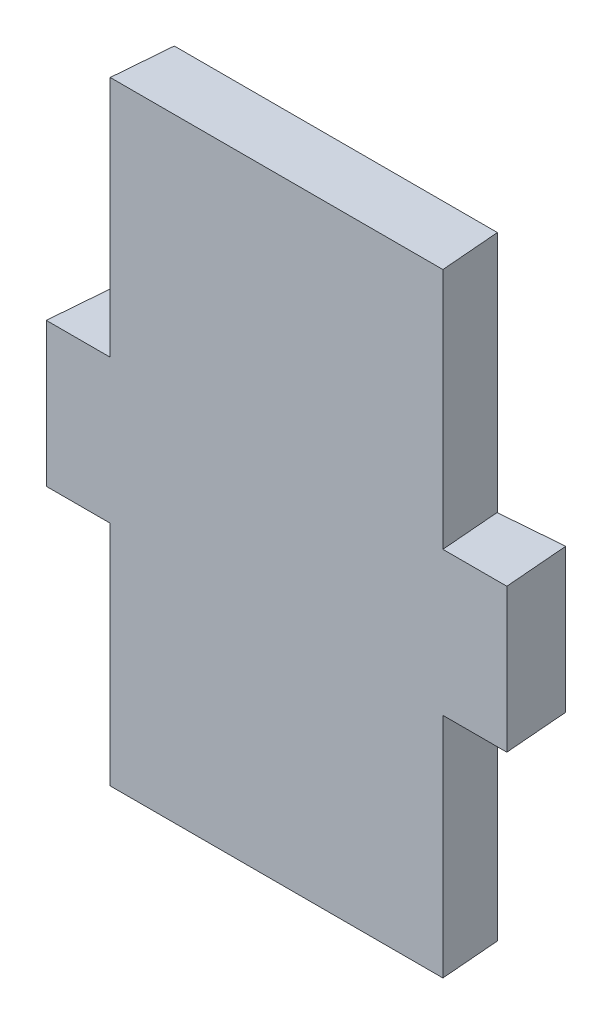
ISO-10303-21;
HEADER;
FILE_DESCRIPTION(('STEP AP214'),'2;1');
FILE_NAME('part.step','',(''),(''),'','','');
FILE_SCHEMA(('AUTOMOTIVE_DESIGN { 1 0 10303 214 1 1 1 1 }'));
ENDSEC;
DATA;
#1=APPLICATION_CONTEXT('core data for automotive mechanical design processes');
#2=APPLICATION_PROTOCOL_DEFINITION('international standard','automotive_design',2000,#1);
#3=PRODUCT_CONTEXT('',#1,'mechanical');
#4=PRODUCT('Part','Part','',(#3));
#5=PRODUCT_RELATED_PRODUCT_CATEGORY('part','',(#4));
#6=PRODUCT_DEFINITION_FORMATION('','',#4);
#7=PRODUCT_DEFINITION_CONTEXT('part definition',#1,'design');
#8=PRODUCT_DEFINITION('design','',#6,#7);
#9=PRODUCT_DEFINITION_SHAPE('','',#8);
#10=(LENGTH_UNIT() NAMED_UNIT(*) SI_UNIT(.MILLI.,.METRE.));
#11=(NAMED_UNIT(*) PLANE_ANGLE_UNIT() SI_UNIT($,.RADIAN.));
#12=(NAMED_UNIT(*) SI_UNIT($,.STERADIAN.) SOLID_ANGLE_UNIT());
#13=UNCERTAINTY_MEASURE_WITH_UNIT(LENGTH_MEASURE(1.E-05),#10,'distance_accuracy_value','');
#14=(GEOMETRIC_REPRESENTATION_CONTEXT(3) GLOBAL_UNCERTAINTY_ASSIGNED_CONTEXT((#13)) GLOBAL_UNIT_ASSIGNED_CONTEXT((#10,
#11,#12)) REPRESENTATION_CONTEXT('',''));
#15=CARTESIAN_POINT('',(0.,0.,0.));
#16=DIRECTION('',(0.,0.,1.));
#17=DIRECTION('',(1.,0.,0.));
#18=AXIS2_PLACEMENT_3D('',#15,#16,#17);
#19=CARTESIAN_POINT('',(15.4310649299438,-45.,55.6777836290186));
#20=DIRECTION('',(0.996750238596396,0.,-0.0805540927453614));
#21=DIRECTION('',(-0.0805540927453614,0.,-0.996750238596396));
#22=AXIS2_PLACEMENT_3D('',#19,#20,#21);
#23=PLANE('',#22);
#24=DIRECTION('',(0.,-1.,0.));
#25=VECTOR('',#24,1.);
#26=CARTESIAN_POINT('',(15.5379221305274,-45.,57.));
#27=LINE('',#26,#25);
#28=CARTESIAN_POINT('',(15.5379221305274,-18.65,57.));
#29=VERTEX_POINT('',#28);
#30=CARTESIAN_POINT('',(15.5379221305274,-28.35,57.));
#31=VERTEX_POINT('',#30);
#32=EDGE_CURVE('E169',#29,#31,#27,.T.);
#33=ORIENTED_EDGE('',*,*,#32,.T.);
#34=DIRECTION('',(-0.0805540927453614,0.,-0.996750238596396));
#35=VECTOR('',#34,1.);
#36=CARTESIAN_POINT('',(15.5621671488759,-28.35,57.3));
#37=LINE('',#36,#35);
#38=CARTESIAN_POINT('',(15.1886147464591,-28.35,52.6777836290185));
#39=VERTEX_POINT('',#38);
#40=EDGE_CURVE('E172',#31,#39,#37,.T.);
#41=ORIENTED_EDGE('',*,*,#40,.T.);
#42=DIRECTION('',(0.,1.,0.));
#43=VECTOR('',#42,1.);
#44=CARTESIAN_POINT('',(15.1886147464591,-45.,52.6777836290185));
#45=LINE('',#44,#43);
#46=CARTESIAN_POINT('',(15.1886147464591,-18.65,52.6777836290186));
#47=VERTEX_POINT('',#46);
#48=EDGE_CURVE('E200',#39,#47,#45,.T.);
#49=ORIENTED_EDGE('',*,*,#48,.T.);
#50=DIRECTION('',(0.0805540927453614,0.,0.996750238596396));
#51=VECTOR('',#50,1.);
#52=CARTESIAN_POINT('',(14.9599410652305,-18.65,49.8482496034069));
#53=LINE('',#52,#51);
#54=EDGE_CURVE('E202',#47,#29,#53,.T.);
#55=ORIENTED_EDGE('',*,*,#54,.T.);
#56=EDGE_LOOP('',(#33,#41,#49,#55));
#57=FACE_BOUND('',#56,.T.);
#58=ADVANCED_FACE('F34',(#57),#23,.T.);
#59=CARTESIAN_POINT('',(-15.4310649299438,-45.,55.6777836290186));
#60=DIRECTION('',(-0.996750238596396,0.,-0.0805540927453614));
#61=DIRECTION('',(0.0805540927453614,0.,-0.996750238596396));
#62=AXIS2_PLACEMENT_3D('',#59,#60,#61);
#63=PLANE('',#62);
#64=DIRECTION('',(0.0805540927453614,0.,-0.996750238596396));
#65=VECTOR('',#64,1.);
#66=CARTESIAN_POINT('',(-15.5621671488759,-28.35,57.3));
#67=LINE('',#66,#65);
#68=CARTESIAN_POINT('',(-15.5379221305274,-28.35,57.));
#69=VERTEX_POINT('',#68);
#70=CARTESIAN_POINT('',(-15.1886147464591,-28.35,52.6777836290185));
#71=VERTEX_POINT('',#70);
#72=EDGE_CURVE('E135',#69,#71,#67,.T.);
#73=ORIENTED_EDGE('',*,*,#72,.F.);
#74=DIRECTION('',(0.,1.,0.));
#75=VECTOR('',#74,1.);
#76=CARTESIAN_POINT('',(-15.5379221305274,-45.,57.));
#77=LINE('',#76,#75);
#78=CARTESIAN_POINT('',(-15.5379221305274,-18.65,57.));
#79=VERTEX_POINT('',#78);
#80=EDGE_CURVE('E145',#69,#79,#77,.T.);
#81=ORIENTED_EDGE('',*,*,#80,.T.);
#82=DIRECTION('',(-0.0805540927453614,0.,0.996750238596396));
#83=VECTOR('',#82,1.);
#84=CARTESIAN_POINT('',(-14.9599410652305,-18.65,49.8482496034069));
#85=LINE('',#84,#83);
#86=CARTESIAN_POINT('',(-15.1886147464591,-18.65,52.6777836290185));
#87=VERTEX_POINT('',#86);
#88=EDGE_CURVE('E155',#87,#79,#85,.T.);
#89=ORIENTED_EDGE('',*,*,#88,.F.);
#90=DIRECTION('',(0.,1.,0.));
#91=VECTOR('',#90,1.);
#92=CARTESIAN_POINT('',(-15.1886147464591,-45.,52.6777836290185));
#93=LINE('',#92,#91);
#94=EDGE_CURVE('E146',#71,#87,#93,.T.);
#95=ORIENTED_EDGE('',*,*,#94,.F.);
#96=EDGE_LOOP('',(#73,#81,#89,#95));
#97=FACE_BOUND('',#96,.T.);
#98=ADVANCED_FACE('F248',(#97),#63,.T.);
#99=CARTESIAN_POINT('',(-10.673915039266,-18.65,50.1946322022119));
#100=DIRECTION('',(0.,-1.,0.));
#101=DIRECTION('',(1.,0.,0.));
#102=AXIS2_PLACEMENT_3D('',#99,#100,#101);
#103=PLANE('',#102);
#104=ORIENTED_EDGE('',*,*,#88,.T.);
#105=DIRECTION('',(-1.,0.,0.));
#106=VECTOR('',#105,1.);
#107=CARTESIAN_POINT('',(15.,-18.65,57.));
#108=LINE('',#107,#106);
#109=CARTESIAN_POINT('',(-11.2239025963508,-18.65,57.));
#110=VERTEX_POINT('',#109);
#111=EDGE_CURVE('E163',#110,#79,#108,.T.);
#112=ORIENTED_EDGE('',*,*,#111,.F.);
#113=DIRECTION('',(-0.0805540927453614,0.,0.996750238596396));
#114=VECTOR('',#113,1.);
#115=CARTESIAN_POINT('',(-10.673915039266,-18.65,50.1946322022119));
#116=LINE('',#115,#114);
#117=CARTESIAN_POINT('',(-10.9025887204946,-18.65,53.0241662278236));
#118=VERTEX_POINT('',#117);
#119=EDGE_CURVE('E152',#118,#110,#116,.T.);
#120=ORIENTED_EDGE('',*,*,#119,.F.);
#121=DIRECTION('',(-0.996750238596396,0.,-0.0805540927453615));
#122=VECTOR('',#121,1.);
#123=CARTESIAN_POINT('',(-15.1886147464591,-18.65,52.6777836290186));
#124=LINE('',#123,#122);
#125=EDGE_CURVE('E138',#118,#87,#124,.T.);
#126=ORIENTED_EDGE('',*,*,#125,.T.);
#127=EDGE_LOOP('',(#104,#112,#120,#126));
#128=FACE_BOUND('',#127,.T.);
#129=ADVANCED_FACE('F253',(#128),#103,.F.);
#130=CARTESIAN_POINT('',(-15.1886147464591,-45.,52.6777836290185));
#131=DIRECTION('',(0.0805540927453615,0.,-0.996750238596396));
#132=DIRECTION('',(-0.996750238596396,0.,-0.0805540927453615));
#133=AXIS2_PLACEMENT_3D('',#130,#131,#132);
#134=PLANE('',#133);
#135=DIRECTION('',(0.996750238596396,0.,0.0805540927453615));
#136=VECTOR('',#135,1.);
#137=CARTESIAN_POINT('',(-15.1886147464591,-28.35,52.6777836290185));
#138=LINE('',#137,#136);
#139=CARTESIAN_POINT('',(-10.9025887204946,-28.35,53.0241662278236));
#140=VERTEX_POINT('',#139);
#141=EDGE_CURVE('E129',#71,#140,#138,.T.);
#142=ORIENTED_EDGE('',*,*,#141,.F.);
#143=ORIENTED_EDGE('',*,*,#94,.T.);
#144=ORIENTED_EDGE('',*,*,#125,.F.);
#145=DIRECTION('',(0.,-1.,0.));
#146=VECTOR('',#145,1.);
#147=CARTESIAN_POINT('',(-10.9025887204946,-18.65,53.0241662278236));
#148=LINE('',#147,#146);
#149=EDGE_CURVE('E141',#118,#140,#148,.T.);
#150=ORIENTED_EDGE('',*,*,#149,.T.);
#151=EDGE_LOOP('',(#142,#143,#144,#150));
#152=FACE_BOUND('',#151,.T.);
#153=ADVANCED_FACE('F142',(#152),#134,.T.);
#154=CARTESIAN_POINT('',(-11.2761411229114,-28.35,57.646382598805));
#155=DIRECTION('',(0.,1.,0.));
#156=DIRECTION('',(-1.,0.,0.));
#157=AXIS2_PLACEMENT_3D('',#154,#155,#156);
#158=PLANE('',#157);
#159=ORIENTED_EDGE('',*,*,#141,.T.);
#160=DIRECTION('',(0.0805540927453614,0.,-0.996750238596396));
#161=VECTOR('',#160,1.);
#162=CARTESIAN_POINT('',(-11.2761411229114,-28.35,57.646382598805));
#163=LINE('',#162,#161);
#164=CARTESIAN_POINT('',(-11.2239025963508,-28.35,57.));
#165=VERTEX_POINT('',#164);
#166=EDGE_CURVE('E133',#165,#140,#163,.T.);
#167=ORIENTED_EDGE('',*,*,#166,.F.);
#168=DIRECTION('',(1.,0.,0.));
#169=VECTOR('',#168,1.);
#170=CARTESIAN_POINT('',(15.,-28.35,57.));
#171=LINE('',#170,#169);
#172=EDGE_CURVE('E161',#69,#165,#171,.T.);
#173=ORIENTED_EDGE('',*,*,#172,.F.);
#174=ORIENTED_EDGE('',*,*,#72,.T.);
#175=EDGE_LOOP('',(#159,#167,#173,#174));
#176=FACE_BOUND('',#175,.T.);
#177=ADVANCED_FACE('F131',(#176),#158,.F.);
#178=CARTESIAN_POINT('',(-17.6548726000009,-43.7,49.7467038984816));
#179=DIRECTION('',(0.,1.,0.));
#180=DIRECTION('',(0.,0.,1.));
#181=AXIS2_PLACEMENT_3D('',#178,#179,#180);
#182=PLANE('',#181);
#183=DIRECTION('',(1.,0.,0.));
#184=VECTOR('',#183,1.);
#185=CARTESIAN_POINT('',(15.,-43.7,53.));
#186=LINE('',#185,#184);
#187=CARTESIAN_POINT('',(-10.9006356850379,-43.7,53.));
#188=VERTEX_POINT('',#187);
#189=CARTESIAN_POINT('',(10.9006356850379,-43.7,53.));
#190=VERTEX_POINT('',#189);
#191=EDGE_CURVE('E42',#188,#190,#186,.T.);
#192=ORIENTED_EDGE('',*,*,#191,.T.);
#193=DIRECTION('',(-0.0805540927453614,0.,-0.996750238596396));
#194=VECTOR('',#193,1.);
#195=CARTESIAN_POINT('',(6.57440938416514,-43.7,-0.531322253831391));
#196=LINE('',#195,#194);
#197=CARTESIAN_POINT('',(11.2239025963508,-43.7,57.));
#198=VERTEX_POINT('',#197);
#199=EDGE_CURVE('E70',#198,#190,#196,.T.);
#200=ORIENTED_EDGE('',*,*,#199,.F.);
#201=DIRECTION('',(1.,0.,0.));
#202=VECTOR('',#201,1.);
#203=CARTESIAN_POINT('',(15.,-43.7,57.));
#204=LINE('',#203,#202);
#205=CARTESIAN_POINT('',(-11.2239025963508,-43.7,57.));
#206=VERTEX_POINT('',#205);
#207=EDGE_CURVE('E179',#206,#198,#204,.T.);
#208=ORIENTED_EDGE('',*,*,#207,.F.);
#209=DIRECTION('',(-0.0805540927453614,0.,0.996750238596396));
#210=VECTOR('',#209,1.);
#211=CARTESIAN_POINT('',(-6.57440938416514,-43.7,-0.531322253831391));
#212=LINE('',#211,#210);
#213=EDGE_CURVE('E153',#188,#206,#212,.T.);
#214=ORIENTED_EDGE('',*,*,#213,.F.);
#215=EDGE_LOOP('',(#192,#200,#208,#214));
#216=FACE_BOUND('',#215,.T.);
#217=ADVANCED_FACE('F244',(#216),#182,.F.);
#218=CARTESIAN_POINT('',(11.2761411229114,-28.35,57.646382598805));
#219=DIRECTION('',(0.,-1.,0.));
#220=DIRECTION('',(1.,0.,0.));
#221=AXIS2_PLACEMENT_3D('',#218,#219,#220);
#222=PLANE('',#221);
#223=DIRECTION('',(-1.,0.,0.));
#224=VECTOR('',#223,1.);
#225=CARTESIAN_POINT('',(15.,-28.35,57.));
#226=LINE('',#225,#224);
#227=CARTESIAN_POINT('',(11.2239025963508,-28.35,57.));
#228=VERTEX_POINT('',#227);
#229=EDGE_CURVE('E207',#31,#228,#226,.T.);
#230=ORIENTED_EDGE('',*,*,#229,.T.);
#231=DIRECTION('',(-0.0805540927453614,0.,-0.996750238596396));
#232=VECTOR('',#231,1.);
#233=CARTESIAN_POINT('',(11.2761411229114,-28.35,57.646382598805));
#234=LINE('',#233,#232);
#235=CARTESIAN_POINT('',(10.9025887204946,-28.35,53.0241662278236));
#236=VERTEX_POINT('',#235);
#237=EDGE_CURVE('E204',#228,#236,#234,.T.);
#238=ORIENTED_EDGE('',*,*,#237,.T.);
#239=DIRECTION('',(0.996750238596396,0.,-0.0805540927453615));
#240=VECTOR('',#239,1.);
#241=CARTESIAN_POINT('',(15.1886147464591,-28.35,52.6777836290185));
#242=LINE('',#241,#240);
#243=EDGE_CURVE('E173',#236,#39,#242,.T.);
#244=ORIENTED_EDGE('',*,*,#243,.T.);
#245=ORIENTED_EDGE('',*,*,#40,.F.);
#246=EDGE_LOOP('',(#230,#238,#244,#245));
#247=FACE_BOUND('',#246,.T.);
#248=ADVANCED_FACE('F232',(#247),#222,.T.);
#249=CARTESIAN_POINT('',(15.1886147464591,-45.,52.6777836290185));
#250=DIRECTION('',(0.0805540927453615,0.,0.996750238596396));
#251=DIRECTION('',(0.996750238596396,0.,-0.0805540927453615));
#252=AXIS2_PLACEMENT_3D('',#249,#250,#251);
#253=PLANE('',#252);
#254=ORIENTED_EDGE('',*,*,#243,.F.);
#255=DIRECTION('',(0.,-1.,0.));
#256=VECTOR('',#255,1.);
#257=CARTESIAN_POINT('',(10.9025887204946,-18.65,53.0241662278236));
#258=LINE('',#257,#256);
#259=CARTESIAN_POINT('',(10.9025887204946,-18.65,53.0241662278236));
#260=VERTEX_POINT('',#259);
#261=EDGE_CURVE('E186',#260,#236,#258,.T.);
#262=ORIENTED_EDGE('',*,*,#261,.F.);
#263=DIRECTION('',(-0.996750238596396,0.,0.0805540927453615));
#264=VECTOR('',#263,1.);
#265=CARTESIAN_POINT('',(15.1886147464591,-18.65,52.6777836290186));
#266=LINE('',#265,#264);
#267=EDGE_CURVE('E162',#47,#260,#266,.T.);
#268=ORIENTED_EDGE('',*,*,#267,.F.);
#269=ORIENTED_EDGE('',*,*,#48,.F.);
#270=EDGE_LOOP('',(#254,#262,#268,#269));
#271=FACE_BOUND('',#270,.T.);
#272=ADVANCED_FACE('F236',(#271),#253,.F.);
#273=CARTESIAN_POINT('',(10.673915039266,-18.65,50.1946322022119));
#274=DIRECTION('',(0.,1.,0.));
#275=DIRECTION('',(-1.,0.,0.));
#276=AXIS2_PLACEMENT_3D('',#273,#274,#275);
#277=PLANE('',#276);
#278=ORIENTED_EDGE('',*,*,#267,.T.);
#279=DIRECTION('',(0.0805540927453614,0.,0.996750238596396));
#280=VECTOR('',#279,1.);
#281=CARTESIAN_POINT('',(10.673915039266,-18.65,50.1946322022119));
#282=LINE('',#281,#280);
#283=CARTESIAN_POINT('',(11.2239025963508,-18.65,57.));
#284=VERTEX_POINT('',#283);
#285=EDGE_CURVE('E214',#260,#284,#282,.T.);
#286=ORIENTED_EDGE('',*,*,#285,.T.);
#287=DIRECTION('',(1.,0.,0.));
#288=VECTOR('',#287,1.);
#289=CARTESIAN_POINT('',(15.,-18.65,57.));
#290=LINE('',#289,#288);
#291=EDGE_CURVE('E213',#284,#29,#290,.T.);
#292=ORIENTED_EDGE('',*,*,#291,.T.);
#293=ORIENTED_EDGE('',*,*,#54,.F.);
#294=EDGE_LOOP('',(#278,#286,#292,#293));
#295=FACE_BOUND('',#294,.T.);
#296=ADVANCED_FACE('F221',(#295),#277,.T.);
#297=CARTESIAN_POINT('',(-6.57440938416514,0.,-0.531322253831391));
#298=DIRECTION('',(0.996750238596396,0.,0.0805540927453614));
#299=DIRECTION('',(0.0805540927453614,0.,-0.996750238596396));
#300=AXIS2_PLACEMENT_3D('',#297,#298,#299);
#301=PLANE('',#300);
#302=DIRECTION('',(0.,-1.,0.));
#303=VECTOR('',#302,1.);
#304=CARTESIAN_POINT('',(-11.2239025963508,-1.00000000000001,57.));
#305=LINE('',#304,#303);
#306=CARTESIAN_POINT('',(-11.2239025963508,-2.3,57.));
#307=VERTEX_POINT('',#306);
#308=EDGE_CURVE('E123',#307,#110,#305,.T.);
#309=ORIENTED_EDGE('',*,*,#308,.F.);
#310=DIRECTION('',(0.0805540927453614,0.,-0.996750238596396));
#311=VECTOR('',#310,1.);
#312=CARTESIAN_POINT('',(-6.57440938416514,-2.3,-0.531322253831391));
#313=LINE('',#312,#311);
#314=CARTESIAN_POINT('',(-10.9006356850379,-2.3,53.));
#315=VERTEX_POINT('',#314);
#316=EDGE_CURVE('E180',#307,#315,#313,.T.);
#317=ORIENTED_EDGE('',*,*,#316,.T.);
#318=DIRECTION('',(0.,-1.,0.));
#319=VECTOR('',#318,1.);
#320=CARTESIAN_POINT('',(-10.9006356850379,-1.00000000000001,53.));
#321=LINE('',#320,#319);
#322=EDGE_CURVE('E57',#315,#188,#321,.T.);
#323=ORIENTED_EDGE('',*,*,#322,.T.);
#324=ORIENTED_EDGE('',*,*,#213,.T.);
#325=DIRECTION('',(0.,-1.,0.));
#326=VECTOR('',#325,1.);
#327=CARTESIAN_POINT('',(-11.2239025963508,-1.00000000000001,57.));
#328=LINE('',#327,#326);
#329=EDGE_CURVE('E151',#165,#206,#328,.T.);
#330=ORIENTED_EDGE('',*,*,#329,.F.);
#331=ORIENTED_EDGE('',*,*,#166,.T.);
#332=ORIENTED_EDGE('',*,*,#149,.F.);
#333=ORIENTED_EDGE('',*,*,#119,.T.);
#334=EDGE_LOOP('',(#309,#317,#323,#324,#330,#331,#332,#333));
#335=FACE_BOUND('',#334,.T.);
#336=ADVANCED_FACE('F149',(#335),#301,.F.);
#337=CARTESIAN_POINT('',(6.57440938416514,0.,-0.531322253831391));
#338=DIRECTION('',(-0.996750238596396,0.,0.0805540927453614));
#339=DIRECTION('',(-0.0805540927453614,0.,-0.996750238596396));
#340=AXIS2_PLACEMENT_3D('',#337,#338,#339);
#341=PLANE('',#340);
#342=DIRECTION('',(0.,1.,0.));
#343=VECTOR('',#342,1.);
#344=CARTESIAN_POINT('',(10.9006356850379,-1.00000000000001,53.));
#345=LINE('',#344,#343);
#346=CARTESIAN_POINT('',(10.9006356850379,-2.3,53.));
#347=VERTEX_POINT('',#346);
#348=EDGE_CURVE('E188',#190,#347,#345,.T.);
#349=ORIENTED_EDGE('',*,*,#348,.T.);
#350=DIRECTION('',(0.0805540927453614,0.,0.996750238596396));
#351=VECTOR('',#350,1.);
#352=CARTESIAN_POINT('',(6.57440938416514,-2.3,-0.531322253831391));
#353=LINE('',#352,#351);
#354=CARTESIAN_POINT('',(11.2239025963508,-2.3,57.));
#355=VERTEX_POINT('',#354);
#356=EDGE_CURVE('E11',#347,#355,#353,.T.);
#357=ORIENTED_EDGE('',*,*,#356,.T.);
#358=DIRECTION('',(0.,1.,0.));
#359=VECTOR('',#358,1.);
#360=CARTESIAN_POINT('',(11.2239025963508,-1.00000000000001,57.));
#361=LINE('',#360,#359);
#362=EDGE_CURVE('E177',#284,#355,#361,.T.);
#363=ORIENTED_EDGE('',*,*,#362,.F.);
#364=ORIENTED_EDGE('',*,*,#285,.F.);
#365=ORIENTED_EDGE('',*,*,#261,.T.);
#366=ORIENTED_EDGE('',*,*,#237,.F.);
#367=DIRECTION('',(0.,1.,0.));
#368=VECTOR('',#367,1.);
#369=CARTESIAN_POINT('',(11.2239025963508,-1.00000000000001,57.));
#370=LINE('',#369,#368);
#371=EDGE_CURVE('E183',#198,#228,#370,.T.);
#372=ORIENTED_EDGE('',*,*,#371,.F.);
#373=ORIENTED_EDGE('',*,*,#199,.T.);
#374=EDGE_LOOP('',(#349,#357,#363,#364,#365,#366,#372,#373));
#375=FACE_BOUND('',#374,.T.);
#376=ADVANCED_FACE('F233',(#375),#341,.F.);
#377=CARTESIAN_POINT('',(15.,-1.00000000000001,57.));
#378=DIRECTION('',(0.,0.,-1.));
#379=DIRECTION('',(0.,1.,0.));
#380=AXIS2_PLACEMENT_3D('',#377,#378,#379);
#381=PLANE('',#380);
#382=ORIENTED_EDGE('',*,*,#362,.T.);
#383=DIRECTION('',(-1.,0.,0.));
#384=VECTOR('',#383,1.);
#385=CARTESIAN_POINT('',(15.,-2.3,57.));
#386=LINE('',#385,#384);
#387=EDGE_CURVE('E49',#355,#307,#386,.T.);
#388=ORIENTED_EDGE('',*,*,#387,.T.);
#389=ORIENTED_EDGE('',*,*,#308,.T.);
#390=ORIENTED_EDGE('',*,*,#111,.T.);
#391=ORIENTED_EDGE('',*,*,#80,.F.);
#392=ORIENTED_EDGE('',*,*,#172,.T.);
#393=ORIENTED_EDGE('',*,*,#329,.T.);
#394=ORIENTED_EDGE('',*,*,#207,.T.);
#395=ORIENTED_EDGE('',*,*,#371,.T.);
#396=ORIENTED_EDGE('',*,*,#229,.F.);
#397=ORIENTED_EDGE('',*,*,#32,.F.);
#398=ORIENTED_EDGE('',*,*,#291,.F.);
#399=EDGE_LOOP('',(#382,#388,#389,#390,#391,#392,#393,#394,#395,#396,#397,#398));
#400=FACE_BOUND('',#399,.T.);
#401=ADVANCED_FACE('F229',(#400),#381,.F.);
#402=CARTESIAN_POINT('',(15.,-1.00000000000001,53.));
#403=DIRECTION('',(0.,0.,-1.));
#404=DIRECTION('',(0.,1.,0.));
#405=AXIS2_PLACEMENT_3D('',#402,#403,#404);
#406=PLANE('',#405);
#407=DIRECTION('',(-1.,0.,0.));
#408=VECTOR('',#407,1.);
#409=CARTESIAN_POINT('',(15.,-2.3,53.));
#410=LINE('',#409,#408);
#411=EDGE_CURVE('E287',#347,#315,#410,.T.);
#412=ORIENTED_EDGE('',*,*,#411,.F.);
#413=ORIENTED_EDGE('',*,*,#348,.F.);
#414=ORIENTED_EDGE('',*,*,#191,.F.);
#415=ORIENTED_EDGE('',*,*,#322,.F.);
#416=EDGE_LOOP('',(#412,#413,#414,#415));
#417=FACE_BOUND('',#416,.T.);
#418=ADVANCED_FACE('F36',(#417),#406,.T.);
#419=CARTESIAN_POINT('',(-17.6548726000009,-2.3,79.9602580336227));
#420=DIRECTION('',(0.,-1.,0.));
#421=DIRECTION('',(0.,0.,-1.));
#422=AXIS2_PLACEMENT_3D('',#419,#420,#421);
#423=PLANE('',#422);
#424=ORIENTED_EDGE('',*,*,#387,.F.);
#425=ORIENTED_EDGE('',*,*,#356,.F.);
#426=ORIENTED_EDGE('',*,*,#411,.T.);
#427=ORIENTED_EDGE('',*,*,#316,.F.);
#428=EDGE_LOOP('',(#424,#425,#426,#427));
#429=FACE_BOUND('',#428,.T.);
#430=ADVANCED_FACE('F267',(#429),#423,.F.);
#431=CLOSED_SHELL('',(#58,#98,#129,#153,#177,#217,#248,#272,#296,#336,#376,#401,#418,#430));
#432=MANIFOLD_SOLID_BREP('B2',#431);
#433=ADVANCED_BREP_SHAPE_REPRESENTATION('',(#18,#432),#14);
#434=SHAPE_DEFINITION_REPRESENTATION(#9,#433);
ENDSEC;
END-ISO-10303-21;
